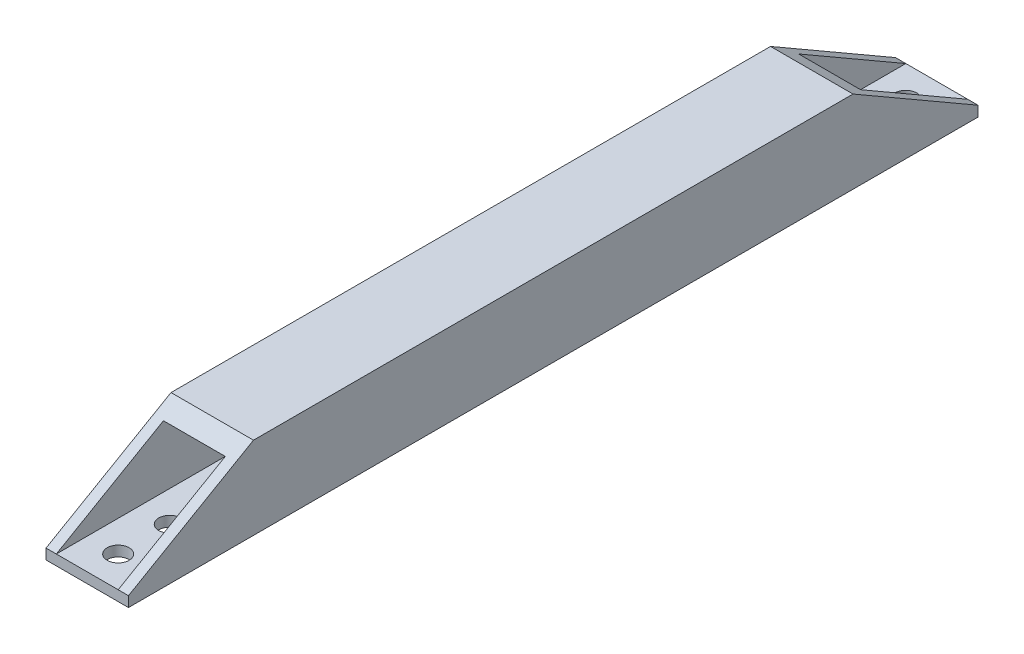
ISO-10303-21;
HEADER;
FILE_DESCRIPTION(('STEP AP214'),'2;1');
FILE_NAME('part.step','',(''),(''),'','','');
FILE_SCHEMA(('AUTOMOTIVE_DESIGN { 1 0 10303 214 1 1 1 1 }'));
ENDSEC;
DATA;
#1=APPLICATION_CONTEXT('core data for automotive mechanical design processes');
#2=APPLICATION_PROTOCOL_DEFINITION('international standard','automotive_design',2000,#1);
#3=PRODUCT_CONTEXT('',#1,'mechanical');
#4=PRODUCT('Part','Part','',(#3));
#5=PRODUCT_RELATED_PRODUCT_CATEGORY('part','',(#4));
#6=PRODUCT_DEFINITION_FORMATION('','',#4);
#7=PRODUCT_DEFINITION_CONTEXT('part definition',#1,'design');
#8=PRODUCT_DEFINITION('design','',#6,#7);
#9=PRODUCT_DEFINITION_SHAPE('','',#8);
#10=(LENGTH_UNIT() NAMED_UNIT(*) SI_UNIT(.MILLI.,.METRE.));
#11=(NAMED_UNIT(*) PLANE_ANGLE_UNIT() SI_UNIT($,.RADIAN.));
#12=(NAMED_UNIT(*) SI_UNIT($,.STERADIAN.) SOLID_ANGLE_UNIT());
#13=UNCERTAINTY_MEASURE_WITH_UNIT(LENGTH_MEASURE(1.E-05),#10,'distance_accuracy_value','');
#14=(GEOMETRIC_REPRESENTATION_CONTEXT(3) GLOBAL_UNCERTAINTY_ASSIGNED_CONTEXT((#13)) GLOBAL_UNIT_ASSIGNED_CONTEXT((#10,
#11,#12)) REPRESENTATION_CONTEXT('',''));
#15=CARTESIAN_POINT('',(0.,0.,0.));
#16=DIRECTION('',(0.,0.,1.));
#17=DIRECTION('',(1.,0.,0.));
#18=AXIS2_PLACEMENT_3D('',#15,#16,#17);
#19=CARTESIAN_POINT('',(-12.7,-12.7,261.62));
#20=DIRECTION('',(0.,1.,0.));
#21=DIRECTION('',(0.,0.,1.));
#22=AXIS2_PLACEMENT_3D('',#19,#20,#21);
#23=PLANE('',#22);
#24=CARTESIAN_POINT('',(0.,-12.7,236.22));
#25=DIRECTION('',(0.,-1.,0.));
#26=DIRECTION('',(0.,0.,-1.));
#27=AXIS2_PLACEMENT_3D('',#24,#25,#26);
#28=CIRCLE('',#27,3.3734375);
#29=CARTESIAN_POINT('',(0.,-12.7,232.8465625));
#30=VERTEX_POINT('',#29);
#31=EDGE_CURVE('E333',#30,#30,#28,.T.);
#32=ORIENTED_EDGE('',*,*,#31,.F.);
#33=EDGE_LOOP('',(#32));
#34=FACE_BOUND('',#33,.T.);
#35=CARTESIAN_POINT('',(0.,-12.7,25.4));
#36=DIRECTION('',(0.,-1.,0.));
#37=DIRECTION('',(0.,0.,-1.));
#38=AXIS2_PLACEMENT_3D('',#35,#36,#37);
#39=CIRCLE('',#38,3.3734375);
#40=CARTESIAN_POINT('',(0.,-12.7,22.0265625));
#41=VERTEX_POINT('',#40);
#42=EDGE_CURVE('E337',#41,#41,#39,.F.);
#43=ORIENTED_EDGE('',*,*,#42,.T.);
#44=EDGE_LOOP('',(#43));
#45=FACE_BOUND('',#44,.T.);
#46=CARTESIAN_POINT('',(0.,-12.7,9.52500000000001));
#47=DIRECTION('',(0.,-1.,0.));
#48=DIRECTION('',(0.,0.,-1.));
#49=AXIS2_PLACEMENT_3D('',#46,#47,#48);
#50=CIRCLE('',#49,3.37343750000001);
#51=CARTESIAN_POINT('',(0.,-12.7,6.1515625));
#52=VERTEX_POINT('',#51);
#53=EDGE_CURVE('E342',#52,#52,#50,.F.);
#54=ORIENTED_EDGE('',*,*,#53,.T.);
#55=EDGE_LOOP('',(#54));
#56=FACE_BOUND('',#55,.T.);
#57=DIRECTION('',(1.,0.,0.));
#58=VECTOR('',#57,1.);
#59=CARTESIAN_POINT('',(-12.7,-12.7,0.));
#60=LINE('',#59,#58);
#61=CARTESIAN_POINT('',(-12.7,-12.7,0.));
#62=VERTEX_POINT('',#61);
#63=CARTESIAN_POINT('',(12.7,-12.7,0.));
#64=VERTEX_POINT('',#63);
#65=EDGE_CURVE('E154',#62,#64,#60,.T.);
#66=ORIENTED_EDGE('',*,*,#65,.T.);
#67=DIRECTION('',(0.,0.,-1.));
#68=VECTOR('',#67,1.);
#69=CARTESIAN_POINT('',(12.7,-12.7,261.62));
#70=LINE('',#69,#68);
#71=CARTESIAN_POINT('',(12.7,-12.7,261.62));
#72=VERTEX_POINT('',#71);
#73=EDGE_CURVE('E152',#72,#64,#70,.T.);
#74=ORIENTED_EDGE('',*,*,#73,.F.);
#75=DIRECTION('',(1.,0.,0.));
#76=VECTOR('',#75,1.);
#77=CARTESIAN_POINT('',(-12.7,-12.7,261.62));
#78=LINE('',#77,#76);
#79=CARTESIAN_POINT('',(-12.7,-12.7,261.62));
#80=VERTEX_POINT('',#79);
#81=EDGE_CURVE('E147',#80,#72,#78,.T.);
#82=ORIENTED_EDGE('',*,*,#81,.F.);
#83=DIRECTION('',(0.,0.,-1.));
#84=VECTOR('',#83,1.);
#85=CARTESIAN_POINT('',(-12.7,-12.7,261.62));
#86=LINE('',#85,#84);
#87=EDGE_CURVE('E144',#80,#62,#86,.T.);
#88=ORIENTED_EDGE('',*,*,#87,.T.);
#89=EDGE_LOOP('',(#66,#74,#82,#88));
#90=FACE_BOUND('',#89,.T.);
#91=CARTESIAN_POINT('',(0.,-12.7,252.095));
#92=DIRECTION('',(0.,-1.,0.));
#93=DIRECTION('',(0.,0.,-1.));
#94=AXIS2_PLACEMENT_3D('',#91,#92,#93);
#95=CIRCLE('',#94,3.37343750000001);
#96=CARTESIAN_POINT('',(0.,-12.7,248.7215625));
#97=VERTEX_POINT('',#96);
#98=EDGE_CURVE('E180',#97,#97,#95,.T.);
#99=ORIENTED_EDGE('',*,*,#98,.F.);
#100=EDGE_LOOP('',(#99));
#101=FACE_BOUND('',#100,.T.);
#102=ADVANCED_FACE('F41',(#34,#45,#56,#90,#101),#23,.F.);
#103=CARTESIAN_POINT('',(-9.525,-9.525,261.62));
#104=DIRECTION('',(0.,1.,0.));
#105=DIRECTION('',(0.,0.,1.));
#106=AXIS2_PLACEMENT_3D('',#103,#104,#105);
#107=PLANE('',#106);
#108=CARTESIAN_POINT('',(0.,-9.525,25.4));
#109=DIRECTION('',(0.,1.,0.));
#110=DIRECTION('',(0.,0.,1.));
#111=AXIS2_PLACEMENT_3D('',#108,#109,#110);
#112=CIRCLE('',#111,3.3734375);
#113=CARTESIAN_POINT('',(0.,-9.525,22.0265625));
#114=VERTEX_POINT('',#113);
#115=EDGE_CURVE('E179',#114,#114,#112,.F.);
#116=ORIENTED_EDGE('',*,*,#115,.T.);
#117=EDGE_LOOP('',(#116));
#118=FACE_BOUND('',#117,.T.);
#119=CARTESIAN_POINT('',(0.,-9.525,9.52500000000001));
#120=DIRECTION('',(0.,1.,0.));
#121=DIRECTION('',(0.,0.,1.));
#122=AXIS2_PLACEMENT_3D('',#119,#120,#121);
#123=CIRCLE('',#122,3.37343750000001);
#124=CARTESIAN_POINT('',(0.,-9.525,6.1515625));
#125=VERTEX_POINT('',#124);
#126=EDGE_CURVE('E175',#125,#125,#123,.F.);
#127=ORIENTED_EDGE('',*,*,#126,.T.);
#128=EDGE_LOOP('',(#127));
#129=FACE_BOUND('',#128,.T.);
#130=DIRECTION('',(1.,0.,0.));
#131=VECTOR('',#130,1.);
#132=CARTESIAN_POINT('',(-9.525,-9.525,0.));
#133=LINE('',#132,#131);
#134=CARTESIAN_POINT('',(-9.525,-9.525,0.));
#135=VERTEX_POINT('',#134);
#136=CARTESIAN_POINT('',(9.52500000000001,-9.525,0.));
#137=VERTEX_POINT('',#136);
#138=EDGE_CURVE('E227',#135,#137,#133,.T.);
#139=ORIENTED_EDGE('',*,*,#138,.F.);
#140=DIRECTION('',(0.,0.,-1.));
#141=VECTOR('',#140,1.);
#142=CARTESIAN_POINT('',(-9.525,-9.525,261.62));
#143=LINE('',#142,#141);
#144=CARTESIAN_POINT('',(-9.525,-9.525,261.62));
#145=VERTEX_POINT('',#144);
#146=EDGE_CURVE('E237',#145,#135,#143,.T.);
#147=ORIENTED_EDGE('',*,*,#146,.F.);
#148=DIRECTION('',(1.,0.,0.));
#149=VECTOR('',#148,1.);
#150=CARTESIAN_POINT('',(-9.525,-9.525,261.62));
#151=LINE('',#150,#149);
#152=CARTESIAN_POINT('',(9.52500000000001,-9.525,261.62));
#153=VERTEX_POINT('',#152);
#154=EDGE_CURVE('E139',#145,#153,#151,.T.);
#155=ORIENTED_EDGE('',*,*,#154,.T.);
#156=DIRECTION('',(0.,0.,-1.));
#157=VECTOR('',#156,1.);
#158=CARTESIAN_POINT('',(9.52500000000001,-9.525,261.62));
#159=LINE('',#158,#157);
#160=EDGE_CURVE('E230',#153,#137,#159,.T.);
#161=ORIENTED_EDGE('',*,*,#160,.T.);
#162=EDGE_LOOP('',(#139,#147,#155,#161));
#163=FACE_BOUND('',#162,.T.);
#164=CARTESIAN_POINT('',(0.,-9.525,236.22));
#165=DIRECTION('',(0.,1.,0.));
#166=DIRECTION('',(0.,0.,1.));
#167=AXIS2_PLACEMENT_3D('',#164,#165,#166);
#168=CIRCLE('',#167,3.3734375);
#169=CARTESIAN_POINT('',(0.,-9.525,232.8465625));
#170=VERTEX_POINT('',#169);
#171=EDGE_CURVE('E183',#170,#170,#168,.T.);
#172=ORIENTED_EDGE('',*,*,#171,.F.);
#173=EDGE_LOOP('',(#172));
#174=FACE_BOUND('',#173,.T.);
#175=CARTESIAN_POINT('',(0.,-9.525,252.095));
#176=DIRECTION('',(0.,1.,0.));
#177=DIRECTION('',(0.,0.,1.));
#178=AXIS2_PLACEMENT_3D('',#175,#176,#177);
#179=CIRCLE('',#178,3.37343750000001);
#180=CARTESIAN_POINT('',(0.,-9.525,248.7215625));
#181=VERTEX_POINT('',#180);
#182=EDGE_CURVE('E45',#181,#181,#179,.T.);
#183=ORIENTED_EDGE('',*,*,#182,.F.);
#184=EDGE_LOOP('',(#183));
#185=FACE_BOUND('',#184,.T.);
#186=ADVANCED_FACE('F289',(#118,#129,#163,#174,#185),#107,.T.);
#187=CARTESIAN_POINT('',(0.,0.,261.62));
#188=DIRECTION('',(0.,0.,-1.));
#189=DIRECTION('',(-1.,0.,0.));
#190=AXIS2_PLACEMENT_3D('',#187,#188,#189);
#191=PLANE('',#190);
#192=DIRECTION('',(0.,1.,0.));
#193=VECTOR('',#192,1.);
#194=CARTESIAN_POINT('',(12.7,-12.7,261.62));
#195=LINE('',#194,#193);
#196=CARTESIAN_POINT('',(12.7,-9.525,261.62));
#197=VERTEX_POINT('',#196);
#198=EDGE_CURVE('E148',#72,#197,#195,.T.);
#199=ORIENTED_EDGE('',*,*,#198,.T.);
#200=DIRECTION('',(1.,0.,0.));
#201=VECTOR('',#200,1.);
#202=CARTESIAN_POINT('',(-12.7,-9.525,261.62));
#203=LINE('',#202,#201);
#204=EDGE_CURVE('E128',#153,#197,#203,.T.);
#205=ORIENTED_EDGE('',*,*,#204,.F.);
#206=ORIENTED_EDGE('',*,*,#154,.F.);
#207=CARTESIAN_POINT('',(-12.7,-9.525,261.62));
#208=VERTEX_POINT('',#207);
#209=EDGE_CURVE('E67',#208,#145,#203,.T.);
#210=ORIENTED_EDGE('',*,*,#209,.F.);
#211=DIRECTION('',(0.,-1.,0.));
#212=VECTOR('',#211,1.);
#213=CARTESIAN_POINT('',(-12.7,-12.7,261.62));
#214=LINE('',#213,#212);
#215=EDGE_CURVE('E135',#208,#80,#214,.T.);
#216=ORIENTED_EDGE('',*,*,#215,.T.);
#217=ORIENTED_EDGE('',*,*,#81,.T.);
#218=EDGE_LOOP('',(#199,#205,#206,#210,#216,#217));
#219=FACE_BOUND('',#218,.T.);
#220=ADVANCED_FACE('F134',(#219),#191,.F.);
#221=CARTESIAN_POINT('',(0.,0.,0.));
#222=DIRECTION('',(0.,0.,-1.));
#223=DIRECTION('',(-1.,0.,0.));
#224=AXIS2_PLACEMENT_3D('',#221,#222,#223);
#225=PLANE('',#224);
#226=DIRECTION('',(1.,0.,0.));
#227=VECTOR('',#226,1.);
#228=CARTESIAN_POINT('',(-12.7,-9.525,0.));
#229=LINE('',#228,#227);
#230=CARTESIAN_POINT('',(12.7,-9.525,0.));
#231=VERTEX_POINT('',#230);
#232=EDGE_CURVE('E207',#137,#231,#229,.T.);
#233=ORIENTED_EDGE('',*,*,#232,.T.);
#234=DIRECTION('',(0.,1.,0.));
#235=VECTOR('',#234,1.);
#236=CARTESIAN_POINT('',(12.7,-12.7,0.));
#237=LINE('',#236,#235);
#238=EDGE_CURVE('E158',#64,#231,#237,.T.);
#239=ORIENTED_EDGE('',*,*,#238,.F.);
#240=ORIENTED_EDGE('',*,*,#65,.F.);
#241=DIRECTION('',(0.,-1.,0.));
#242=VECTOR('',#241,1.);
#243=CARTESIAN_POINT('',(-12.7,-12.7,0.));
#244=LINE('',#243,#242);
#245=CARTESIAN_POINT('',(-12.7,-9.525,0.));
#246=VERTEX_POINT('',#245);
#247=EDGE_CURVE('E162',#246,#62,#244,.T.);
#248=ORIENTED_EDGE('',*,*,#247,.F.);
#249=EDGE_CURVE('E203',#246,#135,#229,.T.);
#250=ORIENTED_EDGE('',*,*,#249,.T.);
#251=ORIENTED_EDGE('',*,*,#138,.T.);
#252=EDGE_LOOP('',(#233,#239,#240,#248,#250,#251));
#253=FACE_BOUND('',#252,.T.);
#254=ADVANCED_FACE('F263',(#253),#225,.T.);
#255=CARTESIAN_POINT('',(12.7,-12.7,261.62));
#256=DIRECTION('',(-1.,0.,0.));
#257=DIRECTION('',(0.,0.,1.));
#258=AXIS2_PLACEMENT_3D('',#255,#256,#257);
#259=PLANE('',#258);
#260=DIRECTION('',(0.,0.,-1.));
#261=VECTOR('',#260,1.);
#262=CARTESIAN_POINT('',(12.7,12.7,261.62));
#263=LINE('',#262,#261);
#264=CARTESIAN_POINT('',(12.7,12.7,223.125170801781));
#265=VERTEX_POINT('',#264);
#266=CARTESIAN_POINT('',(12.7,12.7,38.4948291982188));
#267=VERTEX_POINT('',#266);
#268=EDGE_CURVE('E11',#265,#267,#263,.T.);
#269=ORIENTED_EDGE('',*,*,#268,.F.);
#270=DIRECTION('',(0.,0.499999999999995,-0.866025403784442));
#271=VECTOR('',#270,1.);
#272=CARTESIAN_POINT('',(12.7,12.7,223.125170801781));
#273=LINE('',#272,#271);
#274=EDGE_CURVE('E129',#197,#265,#273,.T.);
#275=ORIENTED_EDGE('',*,*,#274,.F.);
#276=ORIENTED_EDGE('',*,*,#198,.F.);
#277=ORIENTED_EDGE('',*,*,#73,.T.);
#278=ORIENTED_EDGE('',*,*,#238,.T.);
#279=DIRECTION('',(0.,-0.499999999999995,-0.866025403784442));
#280=VECTOR('',#279,1.);
#281=CARTESIAN_POINT('',(12.7,12.7,38.4948291982188));
#282=LINE('',#281,#280);
#283=EDGE_CURVE('E190',#267,#231,#282,.T.);
#284=ORIENTED_EDGE('',*,*,#283,.F.);
#285=EDGE_LOOP('',(#269,#275,#276,#277,#278,#284));
#286=FACE_BOUND('',#285,.T.);
#287=ADVANCED_FACE('F43',(#286),#259,.F.);
#288=CARTESIAN_POINT('',(-12.7,12.7,261.62));
#289=DIRECTION('',(0.,-1.,0.));
#290=DIRECTION('',(0.,0.,-1.));
#291=AXIS2_PLACEMENT_3D('',#288,#289,#290);
#292=PLANE('',#291);
#293=DIRECTION('',(0.,0.,-1.));
#294=VECTOR('',#293,1.);
#295=CARTESIAN_POINT('',(-12.7,12.7,261.62));
#296=LINE('',#295,#294);
#297=CARTESIAN_POINT('',(-12.7,12.7,223.125170801781));
#298=VERTEX_POINT('',#297);
#299=CARTESIAN_POINT('',(-12.7,12.7,38.4948291982188));
#300=VERTEX_POINT('',#299);
#301=EDGE_CURVE('E51',#298,#300,#296,.T.);
#302=ORIENTED_EDGE('',*,*,#301,.F.);
#303=DIRECTION('',(1.,0.,0.));
#304=VECTOR('',#303,1.);
#305=CARTESIAN_POINT('',(-12.7,12.7,223.125170801781));
#306=LINE('',#305,#304);
#307=EDGE_CURVE('E122',#298,#265,#306,.T.);
#308=ORIENTED_EDGE('',*,*,#307,.T.);
#309=ORIENTED_EDGE('',*,*,#268,.T.);
#310=DIRECTION('',(1.,0.,0.));
#311=VECTOR('',#310,1.);
#312=CARTESIAN_POINT('',(-12.7,12.7,38.4948291982188));
#313=LINE('',#312,#311);
#314=EDGE_CURVE('E200',#300,#267,#313,.T.);
#315=ORIENTED_EDGE('',*,*,#314,.F.);
#316=EDGE_LOOP('',(#302,#308,#309,#315));
#317=FACE_BOUND('',#316,.T.);
#318=ADVANCED_FACE('F279',(#317),#292,.F.);
#319=CARTESIAN_POINT('',(-12.7,-12.7,261.62));
#320=DIRECTION('',(1.,0.,0.));
#321=DIRECTION('',(0.,0.,-1.));
#322=AXIS2_PLACEMENT_3D('',#319,#320,#321);
#323=PLANE('',#322);
#324=ORIENTED_EDGE('',*,*,#215,.F.);
#325=DIRECTION('',(0.,0.499999999999995,-0.866025403784442));
#326=VECTOR('',#325,1.);
#327=CARTESIAN_POINT('',(-12.7,12.7,223.125170801781));
#328=LINE('',#327,#326);
#329=EDGE_CURVE('E119',#208,#298,#328,.T.);
#330=ORIENTED_EDGE('',*,*,#329,.T.);
#331=ORIENTED_EDGE('',*,*,#301,.T.);
#332=DIRECTION('',(0.,-0.499999999999995,-0.866025403784442));
#333=VECTOR('',#332,1.);
#334=CARTESIAN_POINT('',(-12.7,12.7,38.4948291982188));
#335=LINE('',#334,#333);
#336=EDGE_CURVE('E194',#300,#246,#335,.T.);
#337=ORIENTED_EDGE('',*,*,#336,.T.);
#338=ORIENTED_EDGE('',*,*,#247,.T.);
#339=ORIENTED_EDGE('',*,*,#87,.F.);
#340=EDGE_LOOP('',(#324,#330,#331,#337,#338,#339));
#341=FACE_BOUND('',#340,.T.);
#342=ADVANCED_FACE('F142',(#341),#323,.F.);
#343=CARTESIAN_POINT('',(9.52500000000001,-9.525,261.62));
#344=DIRECTION('',(-1.,0.,0.));
#345=DIRECTION('',(0.,0.,1.));
#346=AXIS2_PLACEMENT_3D('',#343,#344,#345);
#347=PLANE('',#346);
#348=DIRECTION('',(0.,-0.499999999999995,0.866025403784442));
#349=VECTOR('',#348,1.);
#350=CARTESIAN_POINT('',(9.52500000000001,-9.525,261.62));
#351=LINE('',#350,#349);
#352=CARTESIAN_POINT('',(9.52500000000001,9.525,228.624432115812));
#353=VERTEX_POINT('',#352);
#354=EDGE_CURVE('E224',#353,#153,#351,.T.);
#355=ORIENTED_EDGE('',*,*,#354,.F.);
#356=DIRECTION('',(0.,0.,-1.));
#357=VECTOR('',#356,1.);
#358=CARTESIAN_POINT('',(9.52500000000001,9.525,261.62));
#359=LINE('',#358,#357);
#360=CARTESIAN_POINT('',(9.52500000000001,9.525,32.9955678841875));
#361=VERTEX_POINT('',#360);
#362=EDGE_CURVE('E163',#353,#361,#359,.T.);
#363=ORIENTED_EDGE('',*,*,#362,.T.);
#364=DIRECTION('',(0.,0.499999999999995,0.866025403784442));
#365=VECTOR('',#364,1.);
#366=CARTESIAN_POINT('',(9.52500000000001,103.759783069042,196.215000000001));
#367=LINE('',#366,#365);
#368=EDGE_CURVE('E215',#137,#361,#367,.T.);
#369=ORIENTED_EDGE('',*,*,#368,.F.);
#370=ORIENTED_EDGE('',*,*,#160,.F.);
#371=EDGE_LOOP('',(#355,#363,#369,#370));
#372=FACE_BOUND('',#371,.T.);
#373=ADVANCED_FACE('F250',(#372),#347,.T.);
#374=CARTESIAN_POINT('',(-9.525,9.525,261.62));
#375=DIRECTION('',(0.,-1.,0.));
#376=DIRECTION('',(0.,0.,-1.));
#377=AXIS2_PLACEMENT_3D('',#374,#375,#376);
#378=PLANE('',#377);
#379=DIRECTION('',(1.,0.,0.));
#380=VECTOR('',#379,1.);
#381=CARTESIAN_POINT('',(-9.525,9.525,228.624432115812));
#382=LINE('',#381,#380);
#383=CARTESIAN_POINT('',(-9.525,9.525,228.624432115812));
#384=VERTEX_POINT('',#383);
#385=EDGE_CURVE('E221',#384,#353,#382,.T.);
#386=ORIENTED_EDGE('',*,*,#385,.F.);
#387=DIRECTION('',(0.,0.,-1.));
#388=VECTOR('',#387,1.);
#389=CARTESIAN_POINT('',(-9.525,9.525,261.62));
#390=LINE('',#389,#388);
#391=CARTESIAN_POINT('',(-9.525,9.525,32.9955678841875));
#392=VERTEX_POINT('',#391);
#393=EDGE_CURVE('E241',#384,#392,#390,.T.);
#394=ORIENTED_EDGE('',*,*,#393,.T.);
#395=DIRECTION('',(-1.,0.,0.));
#396=VECTOR('',#395,1.);
#397=CARTESIAN_POINT('',(-9.525,9.525,32.9955678841875));
#398=LINE('',#397,#396);
#399=EDGE_CURVE('E59',#361,#392,#398,.T.);
#400=ORIENTED_EDGE('',*,*,#399,.F.);
#401=ORIENTED_EDGE('',*,*,#362,.F.);
#402=EDGE_LOOP('',(#386,#394,#400,#401));
#403=FACE_BOUND('',#402,.T.);
#404=ADVANCED_FACE('F254',(#403),#378,.T.);
#405=CARTESIAN_POINT('',(-9.525,-9.525,261.62));
#406=DIRECTION('',(1.,0.,0.));
#407=DIRECTION('',(0.,0.,-1.));
#408=AXIS2_PLACEMENT_3D('',#405,#406,#407);
#409=PLANE('',#408);
#410=DIRECTION('',(0.,0.499999999999995,-0.866025403784442));
#411=VECTOR('',#410,1.);
#412=CARTESIAN_POINT('',(-9.525,-9.525,261.62));
#413=LINE('',#412,#411);
#414=EDGE_CURVE('E218',#145,#384,#413,.T.);
#415=ORIENTED_EDGE('',*,*,#414,.F.);
#416=ORIENTED_EDGE('',*,*,#146,.T.);
#417=DIRECTION('',(0.,-0.499999999999995,-0.866025403784442));
#418=VECTOR('',#417,1.);
#419=CARTESIAN_POINT('',(-9.525,103.759783069042,196.215000000001));
#420=LINE('',#419,#418);
#421=EDGE_CURVE('E210',#392,#135,#420,.T.);
#422=ORIENTED_EDGE('',*,*,#421,.F.);
#423=ORIENTED_EDGE('',*,*,#393,.F.);
#424=EDGE_LOOP('',(#415,#416,#422,#423));
#425=FACE_BOUND('',#424,.T.);
#426=ADVANCED_FACE('F257',(#425),#409,.T.);
#427=CARTESIAN_POINT('',(-12.7,12.7,38.4948291982188));
#428=DIRECTION('',(0.,-0.866025403784441,0.499999999999995));
#429=DIRECTION('',(0.,-0.499999999999995,-0.866025403784442));
#430=AXIS2_PLACEMENT_3D('',#427,#428,#429);
#431=PLANE('',#430);
#432=ORIENTED_EDGE('',*,*,#368,.T.);
#433=ORIENTED_EDGE('',*,*,#399,.T.);
#434=ORIENTED_EDGE('',*,*,#421,.T.);
#435=ORIENTED_EDGE('',*,*,#249,.F.);
#436=ORIENTED_EDGE('',*,*,#336,.F.);
#437=ORIENTED_EDGE('',*,*,#314,.T.);
#438=ORIENTED_EDGE('',*,*,#283,.T.);
#439=ORIENTED_EDGE('',*,*,#232,.F.);
#440=EDGE_LOOP('',(#432,#433,#434,#435,#436,#437,#438,#439));
#441=FACE_BOUND('',#440,.T.);
#442=ADVANCED_FACE('F260',(#441),#431,.F.);
#443=CARTESIAN_POINT('',(-12.7,12.7,223.125170801781));
#444=DIRECTION('',(0.,-0.866025403784441,-0.499999999999995));
#445=DIRECTION('',(0.,0.499999999999995,-0.866025403784442));
#446=AXIS2_PLACEMENT_3D('',#443,#444,#445);
#447=PLANE('',#446);
#448=ORIENTED_EDGE('',*,*,#354,.T.);
#449=ORIENTED_EDGE('',*,*,#204,.T.);
#450=ORIENTED_EDGE('',*,*,#274,.T.);
#451=ORIENTED_EDGE('',*,*,#307,.F.);
#452=ORIENTED_EDGE('',*,*,#329,.F.);
#453=ORIENTED_EDGE('',*,*,#209,.T.);
#454=ORIENTED_EDGE('',*,*,#414,.T.);
#455=ORIENTED_EDGE('',*,*,#385,.T.);
#456=EDGE_LOOP('',(#448,#449,#450,#451,#452,#453,#454,#455));
#457=FACE_BOUND('',#456,.T.);
#458=ADVANCED_FACE('F120',(#457),#447,.F.);
#459=CARTESIAN_POINT('',(0.,12.7,9.52500000000001));
#460=DIRECTION('',(0.,-1.,0.));
#461=DIRECTION('',(0.,0.,-1.));
#462=AXIS2_PLACEMENT_3D('',#459,#460,#461);
#463=CYLINDRICAL_SURFACE('',#462,3.37343750000001);
#464=CARTESIAN_POINT('',(0.,-9.525,6.1515625));
#465=CARTESIAN_POINT('',(0.,-9.55807291666666,6.1515625));
#466=CARTESIAN_POINT('',(0.,-9.59114583333333,6.1515625));
#467=CARTESIAN_POINT('',(0.,-9.65729166666666,6.1515625));
#468=CARTESIAN_POINT('',(0.,-9.69036458333333,6.1515625));
#469=CARTESIAN_POINT('',(0.,-9.75651041666666,6.1515625));
#470=CARTESIAN_POINT('',(0.,-9.78958333333333,6.1515625));
#471=CARTESIAN_POINT('',(0.,-9.85572916666666,6.1515625));
#472=CARTESIAN_POINT('',(0.,-9.88880208333333,6.1515625));
#473=CARTESIAN_POINT('',(0.,-9.95494791666666,6.1515625));
#474=CARTESIAN_POINT('',(0.,-9.98802083333333,6.1515625));
#475=CARTESIAN_POINT('',(0.,-10.0541666666667,6.1515625));
#476=CARTESIAN_POINT('',(0.,-10.0872395833333,6.1515625));
#477=CARTESIAN_POINT('',(0.,-10.1533854166667,6.1515625));
#478=CARTESIAN_POINT('',(0.,-10.1864583333333,6.1515625));
#479=CARTESIAN_POINT('',(0.,-10.2526041666667,6.1515625));
#480=CARTESIAN_POINT('',(0.,-10.2856770833333,6.1515625));
#481=CARTESIAN_POINT('',(0.,-10.3518229166667,6.1515625));
#482=CARTESIAN_POINT('',(0.,-10.3848958333333,6.1515625));
#483=CARTESIAN_POINT('',(0.,-10.4510416666667,6.1515625));
#484=CARTESIAN_POINT('',(0.,-10.4841145833333,6.1515625));
#485=CARTESIAN_POINT('',(0.,-10.5502604166667,6.1515625));
#486=CARTESIAN_POINT('',(0.,-10.5833333333333,6.1515625));
#487=CARTESIAN_POINT('',(0.,-10.6494791666667,6.1515625));
#488=CARTESIAN_POINT('',(0.,-10.6825520833333,6.1515625));
#489=CARTESIAN_POINT('',(0.,-10.7486979166667,6.1515625));
#490=CARTESIAN_POINT('',(0.,-10.7817708333333,6.1515625));
#491=CARTESIAN_POINT('',(0.,-10.8479166666667,6.1515625));
#492=CARTESIAN_POINT('',(0.,-10.8809895833333,6.1515625));
#493=CARTESIAN_POINT('',(0.,-10.9471354166667,6.1515625));
#494=CARTESIAN_POINT('',(0.,-10.9802083333333,6.1515625));
#495=CARTESIAN_POINT('',(0.,-11.0463541666667,6.1515625));
#496=CARTESIAN_POINT('',(0.,-11.0794270833333,6.1515625));
#497=CARTESIAN_POINT('',(0.,-11.1455729166667,6.1515625));
#498=CARTESIAN_POINT('',(0.,-11.1786458333333,6.1515625));
#499=CARTESIAN_POINT('',(0.,-11.2447916666667,6.1515625));
#500=CARTESIAN_POINT('',(0.,-11.2778645833333,6.1515625));
#501=CARTESIAN_POINT('',(0.,-11.3440104166667,6.1515625));
#502=CARTESIAN_POINT('',(0.,-11.3770833333333,6.1515625));
#503=CARTESIAN_POINT('',(0.,-11.4432291666667,6.1515625));
#504=CARTESIAN_POINT('',(0.,-11.4763020833333,6.1515625));
#505=CARTESIAN_POINT('',(0.,-11.5424479166667,6.1515625));
#506=CARTESIAN_POINT('',(0.,-11.5755208333333,6.1515625));
#507=CARTESIAN_POINT('',(0.,-11.6416666666667,6.1515625));
#508=CARTESIAN_POINT('',(0.,-11.6747395833333,6.1515625));
#509=CARTESIAN_POINT('',(0.,-11.7408854166667,6.1515625));
#510=CARTESIAN_POINT('',(0.,-11.7739583333333,6.1515625));
#511=CARTESIAN_POINT('',(0.,-11.8401041666667,6.1515625));
#512=CARTESIAN_POINT('',(0.,-11.8731770833333,6.1515625));
#513=CARTESIAN_POINT('',(0.,-11.9393229166667,6.1515625));
#514=CARTESIAN_POINT('',(0.,-11.9723958333333,6.1515625));
#515=CARTESIAN_POINT('',(0.,-12.0385416666667,6.1515625));
#516=CARTESIAN_POINT('',(0.,-12.0716145833333,6.1515625));
#517=CARTESIAN_POINT('',(0.,-12.1377604166667,6.1515625));
#518=CARTESIAN_POINT('',(0.,-12.1708333333333,6.1515625));
#519=CARTESIAN_POINT('',(0.,-12.2369791666667,6.1515625));
#520=CARTESIAN_POINT('',(0.,-12.2700520833333,6.1515625));
#521=CARTESIAN_POINT('',(0.,-12.3361979166667,6.1515625));
#522=CARTESIAN_POINT('',(0.,-12.3692708333333,6.1515625));
#523=CARTESIAN_POINT('',(0.,-12.4354166666667,6.1515625));
#524=CARTESIAN_POINT('',(0.,-12.4684895833333,6.1515625));
#525=CARTESIAN_POINT('',(0.,-12.5346354166667,6.1515625));
#526=CARTESIAN_POINT('',(0.,-12.5677083333333,6.1515625));
#527=CARTESIAN_POINT('',(0.,-12.6338541666667,6.1515625));
#528=CARTESIAN_POINT('',(0.,-12.6669270833333,6.1515625));
#529=CARTESIAN_POINT('',(0.,-12.7,6.1515625));
#530=B_SPLINE_CURVE_WITH_KNOTS('',3,(#464,#465,#466,#467,#468,#469,#470,#471,#472,#473,#474,
#475,#476,#477,#478,#479,#480,#481,#482,#483,#484,#485,#486,#487,#488,#489,#490,#491,#492,#493,
#494,#495,#496,#497,#498,#499,#500,#501,#502,#503,#504,#505,#506,#507,#508,#509,#510,#511,#512,
#513,#514,#515,#516,#517,#518,#519,#520,#521,#522,#523,#524,#525,#526,#527,#528,#529),
.UNSPECIFIED.,.F.,.F.,(4,2,2,2,2,2,2,2,2,2,2,2,2,2,2,2,2,2,2,2,2,2,2,2,2,2,2,2,2,2,2,2,4),(0.,
0.0992187500000012,0.198437499999999,0.29765625,0.396875000000001,0.496093749999999,0.5953125,
0.694531250000002,0.793750000000003,0.892968750000001,0.992187500000002,1.09140625,1.190625,
1.28984375,1.3890625,1.48828125,1.5875,1.68671875,1.7859375,1.88515625,1.984375,2.08359375,
2.1828125,2.28203125,2.38125,2.48046875,2.5796875,2.67890625,2.778125,2.87734375,
2.97656250000001,3.07578125,3.175),.UNSPECIFIED.);
#531=EDGE_CURVE('BSEAM314',#125,#52,#530,.T.);
#532=ORIENTED_EDGE('',*,*,#126,.F.);
#533=ORIENTED_EDGE('',*,*,#53,.F.);
#534=ORIENTED_EDGE('',*,*,#531,.T.);
#535=ORIENTED_EDGE('',*,*,#531,.F.);
#536=EDGE_LOOP('',(#532,#534,#533,#535));
#537=FACE_BOUND('',#536,.T.);
#538=ADVANCED_FACE('F314',(#537),#463,.F.);
#539=CARTESIAN_POINT('',(0.,12.7,25.4));
#540=DIRECTION('',(0.,-1.,0.));
#541=DIRECTION('',(0.,0.,-1.));
#542=AXIS2_PLACEMENT_3D('',#539,#540,#541);
#543=CYLINDRICAL_SURFACE('',#542,3.3734375);
#544=CARTESIAN_POINT('',(0.,-9.525,22.0265625));
#545=CARTESIAN_POINT('',(0.,-9.55807291666666,22.0265625));
#546=CARTESIAN_POINT('',(0.,-9.59114583333333,22.0265625));
#547=CARTESIAN_POINT('',(0.,-9.65729166666666,22.0265625));
#548=CARTESIAN_POINT('',(0.,-9.69036458333333,22.0265625));
#549=CARTESIAN_POINT('',(0.,-9.75651041666666,22.0265625));
#550=CARTESIAN_POINT('',(0.,-9.78958333333333,22.0265625));
#551=CARTESIAN_POINT('',(0.,-9.85572916666666,22.0265625));
#552=CARTESIAN_POINT('',(0.,-9.88880208333333,22.0265625));
#553=CARTESIAN_POINT('',(0.,-9.95494791666666,22.0265625));
#554=CARTESIAN_POINT('',(0.,-9.98802083333333,22.0265625));
#555=CARTESIAN_POINT('',(0.,-10.0541666666667,22.0265625));
#556=CARTESIAN_POINT('',(0.,-10.0872395833333,22.0265625));
#557=CARTESIAN_POINT('',(0.,-10.1533854166667,22.0265625));
#558=CARTESIAN_POINT('',(0.,-10.1864583333333,22.0265625));
#559=CARTESIAN_POINT('',(0.,-10.2526041666667,22.0265625));
#560=CARTESIAN_POINT('',(0.,-10.2856770833333,22.0265625));
#561=CARTESIAN_POINT('',(0.,-10.3518229166667,22.0265625));
#562=CARTESIAN_POINT('',(0.,-10.3848958333333,22.0265625));
#563=CARTESIAN_POINT('',(0.,-10.4510416666667,22.0265625));
#564=CARTESIAN_POINT('',(0.,-10.4841145833333,22.0265625));
#565=CARTESIAN_POINT('',(0.,-10.5502604166667,22.0265625));
#566=CARTESIAN_POINT('',(0.,-10.5833333333333,22.0265625));
#567=CARTESIAN_POINT('',(0.,-10.6494791666667,22.0265625));
#568=CARTESIAN_POINT('',(0.,-10.6825520833333,22.0265625));
#569=CARTESIAN_POINT('',(0.,-10.7486979166667,22.0265625));
#570=CARTESIAN_POINT('',(0.,-10.7817708333333,22.0265625));
#571=CARTESIAN_POINT('',(0.,-10.8479166666667,22.0265625));
#572=CARTESIAN_POINT('',(0.,-10.8809895833333,22.0265625));
#573=CARTESIAN_POINT('',(0.,-10.9471354166667,22.0265625));
#574=CARTESIAN_POINT('',(0.,-10.9802083333333,22.0265625));
#575=CARTESIAN_POINT('',(0.,-11.0463541666667,22.0265625));
#576=CARTESIAN_POINT('',(0.,-11.0794270833333,22.0265625));
#577=CARTESIAN_POINT('',(0.,-11.1455729166667,22.0265625));
#578=CARTESIAN_POINT('',(0.,-11.1786458333333,22.0265625));
#579=CARTESIAN_POINT('',(0.,-11.2447916666667,22.0265625));
#580=CARTESIAN_POINT('',(0.,-11.2778645833333,22.0265625));
#581=CARTESIAN_POINT('',(0.,-11.3440104166667,22.0265625));
#582=CARTESIAN_POINT('',(0.,-11.3770833333333,22.0265625));
#583=CARTESIAN_POINT('',(0.,-11.4432291666667,22.0265625));
#584=CARTESIAN_POINT('',(0.,-11.4763020833333,22.0265625));
#585=CARTESIAN_POINT('',(0.,-11.5424479166667,22.0265625));
#586=CARTESIAN_POINT('',(0.,-11.5755208333333,22.0265625));
#587=CARTESIAN_POINT('',(0.,-11.6416666666667,22.0265625));
#588=CARTESIAN_POINT('',(0.,-11.6747395833333,22.0265625));
#589=CARTESIAN_POINT('',(0.,-11.7408854166667,22.0265625));
#590=CARTESIAN_POINT('',(0.,-11.7739583333333,22.0265625));
#591=CARTESIAN_POINT('',(0.,-11.8401041666667,22.0265625));
#592=CARTESIAN_POINT('',(0.,-11.8731770833333,22.0265625));
#593=CARTESIAN_POINT('',(0.,-11.9393229166667,22.0265625));
#594=CARTESIAN_POINT('',(0.,-11.9723958333333,22.0265625));
#595=CARTESIAN_POINT('',(0.,-12.0385416666667,22.0265625));
#596=CARTESIAN_POINT('',(0.,-12.0716145833333,22.0265625));
#597=CARTESIAN_POINT('',(0.,-12.1377604166667,22.0265625));
#598=CARTESIAN_POINT('',(0.,-12.1708333333333,22.0265625));
#599=CARTESIAN_POINT('',(0.,-12.2369791666667,22.0265625));
#600=CARTESIAN_POINT('',(0.,-12.2700520833333,22.0265625));
#601=CARTESIAN_POINT('',(0.,-12.3361979166667,22.0265625));
#602=CARTESIAN_POINT('',(0.,-12.3692708333333,22.0265625));
#603=CARTESIAN_POINT('',(0.,-12.4354166666667,22.0265625));
#604=CARTESIAN_POINT('',(0.,-12.4684895833333,22.0265625));
#605=CARTESIAN_POINT('',(0.,-12.5346354166667,22.0265625));
#606=CARTESIAN_POINT('',(0.,-12.5677083333333,22.0265625));
#607=CARTESIAN_POINT('',(0.,-12.6338541666667,22.0265625));
#608=CARTESIAN_POINT('',(0.,-12.6669270833333,22.0265625));
#609=CARTESIAN_POINT('',(0.,-12.7,22.0265625));
#610=B_SPLINE_CURVE_WITH_KNOTS('',3,(#544,#545,#546,#547,#548,#549,#550,#551,#552,#553,#554,
#555,#556,#557,#558,#559,#560,#561,#562,#563,#564,#565,#566,#567,#568,#569,#570,#571,#572,#573,
#574,#575,#576,#577,#578,#579,#580,#581,#582,#583,#584,#585,#586,#587,#588,#589,#590,#591,#592,
#593,#594,#595,#596,#597,#598,#599,#600,#601,#602,#603,#604,#605,#606,#607,#608,#609),
.UNSPECIFIED.,.F.,.F.,(4,2,2,2,2,2,2,2,2,2,2,2,2,2,2,2,2,2,2,2,2,2,2,2,2,2,2,2,2,2,2,2,4),(0.,
0.0992187500000012,0.198437499999999,0.29765625,0.396875000000001,0.496093749999999,0.5953125,
0.694531250000002,0.793750000000003,0.892968750000001,0.992187500000002,1.09140625,1.190625,
1.28984375,1.3890625,1.48828125,1.5875,1.68671875,1.7859375,1.88515625,1.984375,2.08359375,
2.1828125,2.28203125,2.38125,2.48046875,2.5796875,2.67890625,2.778125,2.87734375,
2.97656250000001,3.07578125,3.175),.UNSPECIFIED.);
#611=EDGE_CURVE('BSEAM317',#114,#41,#610,.T.);
#612=ORIENTED_EDGE('',*,*,#115,.F.);
#613=ORIENTED_EDGE('',*,*,#42,.F.);
#614=ORIENTED_EDGE('',*,*,#611,.T.);
#615=ORIENTED_EDGE('',*,*,#611,.F.);
#616=EDGE_LOOP('',(#612,#614,#613,#615));
#617=FACE_BOUND('',#616,.T.);
#618=ADVANCED_FACE('F317',(#617),#543,.F.);
#619=CARTESIAN_POINT('',(0.,12.7,236.22));
#620=DIRECTION('',(0.,-1.,0.));
#621=DIRECTION('',(0.,0.,-1.));
#622=AXIS2_PLACEMENT_3D('',#619,#620,#621);
#623=CYLINDRICAL_SURFACE('',#622,3.3734375);
#624=CARTESIAN_POINT('',(0.,-9.525,232.8465625));
#625=CARTESIAN_POINT('',(0.,-9.55807291666666,232.8465625));
#626=CARTESIAN_POINT('',(0.,-9.59114583333333,232.8465625));
#627=CARTESIAN_POINT('',(0.,-9.65729166666666,232.8465625));
#628=CARTESIAN_POINT('',(0.,-9.69036458333333,232.8465625));
#629=CARTESIAN_POINT('',(0.,-9.75651041666666,232.8465625));
#630=CARTESIAN_POINT('',(0.,-9.78958333333333,232.8465625));
#631=CARTESIAN_POINT('',(0.,-9.85572916666666,232.8465625));
#632=CARTESIAN_POINT('',(0.,-9.88880208333333,232.8465625));
#633=CARTESIAN_POINT('',(0.,-9.95494791666666,232.8465625));
#634=CARTESIAN_POINT('',(0.,-9.98802083333333,232.8465625));
#635=CARTESIAN_POINT('',(0.,-10.0541666666667,232.8465625));
#636=CARTESIAN_POINT('',(0.,-10.0872395833333,232.8465625));
#637=CARTESIAN_POINT('',(0.,-10.1533854166667,232.8465625));
#638=CARTESIAN_POINT('',(0.,-10.1864583333333,232.8465625));
#639=CARTESIAN_POINT('',(0.,-10.2526041666667,232.8465625));
#640=CARTESIAN_POINT('',(0.,-10.2856770833333,232.8465625));
#641=CARTESIAN_POINT('',(0.,-10.3518229166667,232.8465625));
#642=CARTESIAN_POINT('',(0.,-10.3848958333333,232.8465625));
#643=CARTESIAN_POINT('',(0.,-10.4510416666667,232.8465625));
#644=CARTESIAN_POINT('',(0.,-10.4841145833333,232.8465625));
#645=CARTESIAN_POINT('',(0.,-10.5502604166667,232.8465625));
#646=CARTESIAN_POINT('',(0.,-10.5833333333333,232.8465625));
#647=CARTESIAN_POINT('',(0.,-10.6494791666667,232.8465625));
#648=CARTESIAN_POINT('',(0.,-10.6825520833333,232.8465625));
#649=CARTESIAN_POINT('',(0.,-10.7486979166667,232.8465625));
#650=CARTESIAN_POINT('',(0.,-10.7817708333333,232.8465625));
#651=CARTESIAN_POINT('',(0.,-10.8479166666667,232.8465625));
#652=CARTESIAN_POINT('',(0.,-10.8809895833333,232.8465625));
#653=CARTESIAN_POINT('',(0.,-10.9471354166667,232.8465625));
#654=CARTESIAN_POINT('',(0.,-10.9802083333333,232.8465625));
#655=CARTESIAN_POINT('',(0.,-11.0463541666667,232.8465625));
#656=CARTESIAN_POINT('',(0.,-11.0794270833333,232.8465625));
#657=CARTESIAN_POINT('',(0.,-11.1455729166667,232.8465625));
#658=CARTESIAN_POINT('',(0.,-11.1786458333333,232.8465625));
#659=CARTESIAN_POINT('',(0.,-11.2447916666667,232.8465625));
#660=CARTESIAN_POINT('',(0.,-11.2778645833333,232.8465625));
#661=CARTESIAN_POINT('',(0.,-11.3440104166667,232.8465625));
#662=CARTESIAN_POINT('',(0.,-11.3770833333333,232.8465625));
#663=CARTESIAN_POINT('',(0.,-11.4432291666667,232.8465625));
#664=CARTESIAN_POINT('',(0.,-11.4763020833333,232.8465625));
#665=CARTESIAN_POINT('',(0.,-11.5424479166667,232.8465625));
#666=CARTESIAN_POINT('',(0.,-11.5755208333333,232.8465625));
#667=CARTESIAN_POINT('',(0.,-11.6416666666667,232.8465625));
#668=CARTESIAN_POINT('',(0.,-11.6747395833333,232.8465625));
#669=CARTESIAN_POINT('',(0.,-11.7408854166667,232.8465625));
#670=CARTESIAN_POINT('',(0.,-11.7739583333333,232.8465625));
#671=CARTESIAN_POINT('',(0.,-11.8401041666667,232.8465625));
#672=CARTESIAN_POINT('',(0.,-11.8731770833333,232.8465625));
#673=CARTESIAN_POINT('',(0.,-11.9393229166667,232.8465625));
#674=CARTESIAN_POINT('',(0.,-11.9723958333333,232.8465625));
#675=CARTESIAN_POINT('',(0.,-12.0385416666667,232.8465625));
#676=CARTESIAN_POINT('',(0.,-12.0716145833333,232.8465625));
#677=CARTESIAN_POINT('',(0.,-12.1377604166667,232.8465625));
#678=CARTESIAN_POINT('',(0.,-12.1708333333333,232.8465625));
#679=CARTESIAN_POINT('',(0.,-12.2369791666667,232.8465625));
#680=CARTESIAN_POINT('',(0.,-12.2700520833333,232.8465625));
#681=CARTESIAN_POINT('',(0.,-12.3361979166667,232.8465625));
#682=CARTESIAN_POINT('',(0.,-12.3692708333333,232.8465625));
#683=CARTESIAN_POINT('',(0.,-12.4354166666667,232.8465625));
#684=CARTESIAN_POINT('',(0.,-12.4684895833333,232.8465625));
#685=CARTESIAN_POINT('',(0.,-12.5346354166667,232.8465625));
#686=CARTESIAN_POINT('',(0.,-12.5677083333333,232.8465625));
#687=CARTESIAN_POINT('',(0.,-12.6338541666667,232.8465625));
#688=CARTESIAN_POINT('',(0.,-12.6669270833333,232.8465625));
#689=CARTESIAN_POINT('',(0.,-12.7,232.8465625));
#690=B_SPLINE_CURVE_WITH_KNOTS('',3,(#624,#625,#626,#627,#628,#629,#630,#631,#632,#633,#634,
#635,#636,#637,#638,#639,#640,#641,#642,#643,#644,#645,#646,#647,#648,#649,#650,#651,#652,#653,
#654,#655,#656,#657,#658,#659,#660,#661,#662,#663,#664,#665,#666,#667,#668,#669,#670,#671,#672,
#673,#674,#675,#676,#677,#678,#679,#680,#681,#682,#683,#684,#685,#686,#687,#688,#689),
.UNSPECIFIED.,.F.,.F.,(4,2,2,2,2,2,2,2,2,2,2,2,2,2,2,2,2,2,2,2,2,2,2,2,2,2,2,2,2,2,2,2,4),(0.,
0.0992187500000012,0.198437499999999,0.29765625,0.396875000000001,0.496093749999999,0.5953125,
0.694531250000002,0.793750000000003,0.892968750000001,0.992187500000002,1.09140625,1.190625,
1.28984375,1.3890625,1.48828125,1.5875,1.68671875,1.7859375,1.88515625,1.984375,2.08359375,
2.1828125,2.28203125,2.38125,2.48046875,2.5796875,2.67890625,2.778125,2.87734375,
2.97656250000001,3.07578125,3.175),.UNSPECIFIED.);
#691=EDGE_CURVE('BSEAM321',#170,#30,#690,.T.);
#692=ORIENTED_EDGE('',*,*,#171,.T.);
#693=ORIENTED_EDGE('',*,*,#31,.T.);
#694=ORIENTED_EDGE('',*,*,#691,.T.);
#695=ORIENTED_EDGE('',*,*,#691,.F.);
#696=EDGE_LOOP('',(#692,#694,#693,#695));
#697=FACE_BOUND('',#696,.T.);
#698=ADVANCED_FACE('F321',(#697),#623,.F.);
#699=CARTESIAN_POINT('',(0.,12.7,252.095));
#700=DIRECTION('',(0.,-1.,0.));
#701=DIRECTION('',(0.,0.,-1.));
#702=AXIS2_PLACEMENT_3D('',#699,#700,#701);
#703=CYLINDRICAL_SURFACE('',#702,3.37343750000001);
#704=CARTESIAN_POINT('',(0.,-9.525,248.7215625));
#705=CARTESIAN_POINT('',(0.,-9.55807291666666,248.7215625));
#706=CARTESIAN_POINT('',(0.,-9.59114583333333,248.7215625));
#707=CARTESIAN_POINT('',(0.,-9.65729166666666,248.7215625));
#708=CARTESIAN_POINT('',(0.,-9.69036458333333,248.7215625));
#709=CARTESIAN_POINT('',(0.,-9.75651041666666,248.7215625));
#710=CARTESIAN_POINT('',(0.,-9.78958333333333,248.7215625));
#711=CARTESIAN_POINT('',(0.,-9.85572916666666,248.7215625));
#712=CARTESIAN_POINT('',(0.,-9.88880208333333,248.7215625));
#713=CARTESIAN_POINT('',(0.,-9.95494791666666,248.7215625));
#714=CARTESIAN_POINT('',(0.,-9.98802083333333,248.7215625));
#715=CARTESIAN_POINT('',(0.,-10.0541666666667,248.7215625));
#716=CARTESIAN_POINT('',(0.,-10.0872395833333,248.7215625));
#717=CARTESIAN_POINT('',(0.,-10.1533854166667,248.7215625));
#718=CARTESIAN_POINT('',(0.,-10.1864583333333,248.7215625));
#719=CARTESIAN_POINT('',(0.,-10.2526041666667,248.7215625));
#720=CARTESIAN_POINT('',(0.,-10.2856770833333,248.7215625));
#721=CARTESIAN_POINT('',(0.,-10.3518229166667,248.7215625));
#722=CARTESIAN_POINT('',(0.,-10.3848958333333,248.7215625));
#723=CARTESIAN_POINT('',(0.,-10.4510416666667,248.7215625));
#724=CARTESIAN_POINT('',(0.,-10.4841145833333,248.7215625));
#725=CARTESIAN_POINT('',(0.,-10.5502604166667,248.7215625));
#726=CARTESIAN_POINT('',(0.,-10.5833333333333,248.7215625));
#727=CARTESIAN_POINT('',(0.,-10.6494791666667,248.7215625));
#728=CARTESIAN_POINT('',(0.,-10.6825520833333,248.7215625));
#729=CARTESIAN_POINT('',(0.,-10.7486979166667,248.7215625));
#730=CARTESIAN_POINT('',(0.,-10.7817708333333,248.7215625));
#731=CARTESIAN_POINT('',(0.,-10.8479166666667,248.7215625));
#732=CARTESIAN_POINT('',(0.,-10.8809895833333,248.7215625));
#733=CARTESIAN_POINT('',(0.,-10.9471354166667,248.7215625));
#734=CARTESIAN_POINT('',(0.,-10.9802083333333,248.7215625));
#735=CARTESIAN_POINT('',(0.,-11.0463541666667,248.7215625));
#736=CARTESIAN_POINT('',(0.,-11.0794270833333,248.7215625));
#737=CARTESIAN_POINT('',(0.,-11.1455729166667,248.7215625));
#738=CARTESIAN_POINT('',(0.,-11.1786458333333,248.7215625));
#739=CARTESIAN_POINT('',(0.,-11.2447916666667,248.7215625));
#740=CARTESIAN_POINT('',(0.,-11.2778645833333,248.7215625));
#741=CARTESIAN_POINT('',(0.,-11.3440104166667,248.7215625));
#742=CARTESIAN_POINT('',(0.,-11.3770833333333,248.7215625));
#743=CARTESIAN_POINT('',(0.,-11.4432291666667,248.7215625));
#744=CARTESIAN_POINT('',(0.,-11.4763020833333,248.7215625));
#745=CARTESIAN_POINT('',(0.,-11.5424479166667,248.7215625));
#746=CARTESIAN_POINT('',(0.,-11.5755208333333,248.7215625));
#747=CARTESIAN_POINT('',(0.,-11.6416666666667,248.7215625));
#748=CARTESIAN_POINT('',(0.,-11.6747395833333,248.7215625));
#749=CARTESIAN_POINT('',(0.,-11.7408854166667,248.7215625));
#750=CARTESIAN_POINT('',(0.,-11.7739583333333,248.7215625));
#751=CARTESIAN_POINT('',(0.,-11.8401041666667,248.7215625));
#752=CARTESIAN_POINT('',(0.,-11.8731770833333,248.7215625));
#753=CARTESIAN_POINT('',(0.,-11.9393229166667,248.7215625));
#754=CARTESIAN_POINT('',(0.,-11.9723958333333,248.7215625));
#755=CARTESIAN_POINT('',(0.,-12.0385416666667,248.7215625));
#756=CARTESIAN_POINT('',(0.,-12.0716145833333,248.7215625));
#757=CARTESIAN_POINT('',(0.,-12.1377604166667,248.7215625));
#758=CARTESIAN_POINT('',(0.,-12.1708333333333,248.7215625));
#759=CARTESIAN_POINT('',(0.,-12.2369791666667,248.7215625));
#760=CARTESIAN_POINT('',(0.,-12.2700520833333,248.7215625));
#761=CARTESIAN_POINT('',(0.,-12.3361979166667,248.7215625));
#762=CARTESIAN_POINT('',(0.,-12.3692708333333,248.7215625));
#763=CARTESIAN_POINT('',(0.,-12.4354166666667,248.7215625));
#764=CARTESIAN_POINT('',(0.,-12.4684895833333,248.7215625));
#765=CARTESIAN_POINT('',(0.,-12.5346354166667,248.7215625));
#766=CARTESIAN_POINT('',(0.,-12.5677083333333,248.7215625));
#767=CARTESIAN_POINT('',(0.,-12.6338541666667,248.7215625));
#768=CARTESIAN_POINT('',(0.,-12.6669270833333,248.7215625));
#769=CARTESIAN_POINT('',(0.,-12.7,248.7215625));
#770=B_SPLINE_CURVE_WITH_KNOTS('',3,(#704,#705,#706,#707,#708,#709,#710,#711,#712,#713,#714,
#715,#716,#717,#718,#719,#720,#721,#722,#723,#724,#725,#726,#727,#728,#729,#730,#731,#732,#733,
#734,#735,#736,#737,#738,#739,#740,#741,#742,#743,#744,#745,#746,#747,#748,#749,#750,#751,#752,
#753,#754,#755,#756,#757,#758,#759,#760,#761,#762,#763,#764,#765,#766,#767,#768,#769),
.UNSPECIFIED.,.F.,.F.,(4,2,2,2,2,2,2,2,2,2,2,2,2,2,2,2,2,2,2,2,2,2,2,2,2,2,2,2,2,2,2,2,4),(0.,
0.0992187500000012,0.198437499999999,0.29765625,0.396875000000001,0.496093749999999,0.5953125,
0.694531250000002,0.793750000000003,0.892968750000001,0.992187500000002,1.09140625,1.190625,
1.28984375,1.3890625,1.48828125,1.5875,1.68671875,1.7859375,1.88515625,1.984375,2.08359375,
2.1828125,2.28203125,2.38125,2.48046875,2.5796875,2.67890625,2.778125,2.87734375,
2.97656250000001,3.07578125,3.175),.UNSPECIFIED.);
#771=EDGE_CURVE('BSEAM325',#181,#97,#770,.T.);
#772=ORIENTED_EDGE('',*,*,#182,.T.);
#773=ORIENTED_EDGE('',*,*,#98,.T.);
#774=ORIENTED_EDGE('',*,*,#771,.T.);
#775=ORIENTED_EDGE('',*,*,#771,.F.);
#776=EDGE_LOOP('',(#772,#774,#773,#775));
#777=FACE_BOUND('',#776,.T.);
#778=ADVANCED_FACE('F325',(#777),#703,.F.);
#779=CLOSED_SHELL('',(#102,#186,#220,#254,#287,#318,#342,#373,#404,#426,#442,#458,#538,#618,
#698,#778));
#780=MANIFOLD_SOLID_BREP('B2',#779);
#781=ADVANCED_BREP_SHAPE_REPRESENTATION('',(#18,#780),#14);
#782=SHAPE_DEFINITION_REPRESENTATION(#9,#781);
ENDSEC;
END-ISO-10303-21;
